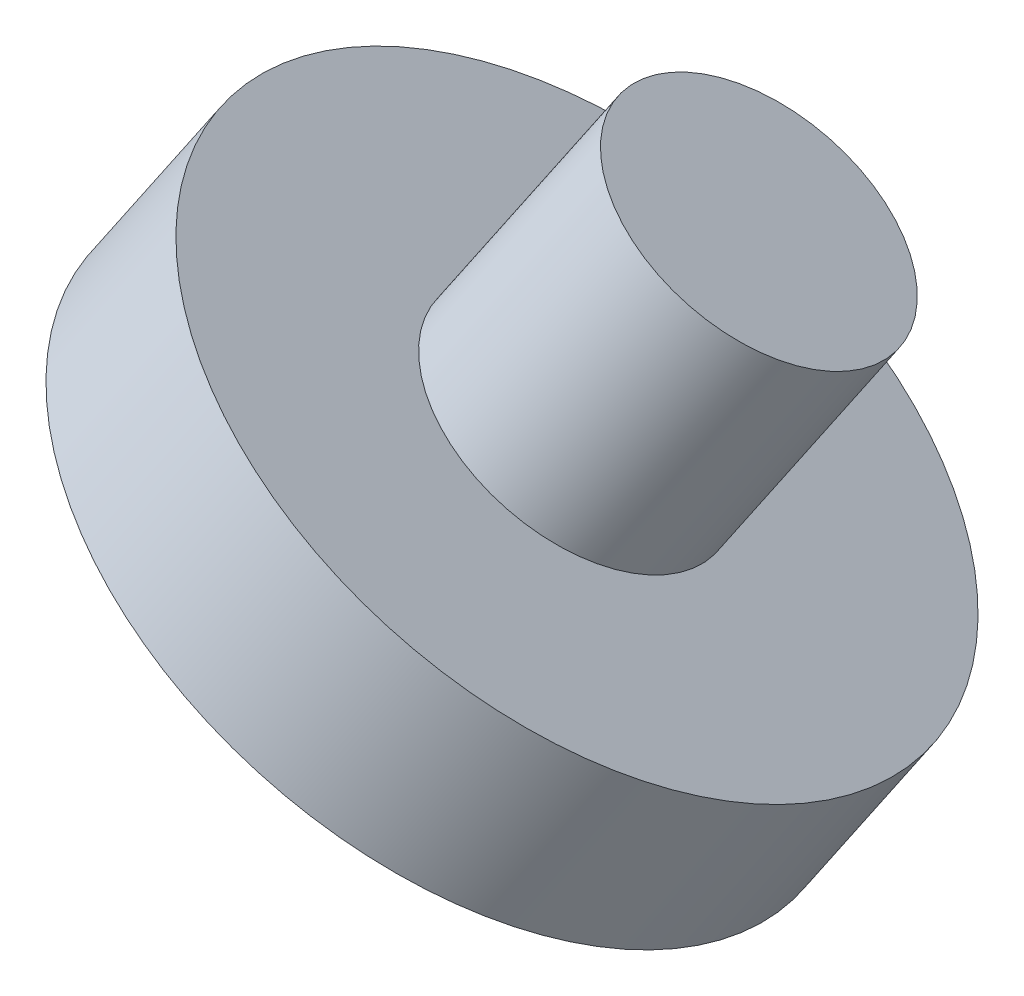
ISO-10303-21;
HEADER;
FILE_DESCRIPTION(('STEP AP214'),'2;1');
FILE_NAME('part.step','',(''),(''),'','','');
FILE_SCHEMA(('AUTOMOTIVE_DESIGN { 1 0 10303 214 1 1 1 1 }'));
ENDSEC;
DATA;
#1=APPLICATION_CONTEXT('core data for automotive mechanical design processes');
#2=APPLICATION_PROTOCOL_DEFINITION('international standard','automotive_design',2000,#1);
#3=PRODUCT_CONTEXT('',#1,'mechanical');
#4=PRODUCT('Part','Part','',(#3));
#5=PRODUCT_RELATED_PRODUCT_CATEGORY('part','',(#4));
#6=PRODUCT_DEFINITION_FORMATION('','',#4);
#7=PRODUCT_DEFINITION_CONTEXT('part definition',#1,'design');
#8=PRODUCT_DEFINITION('design','',#6,#7);
#9=PRODUCT_DEFINITION_SHAPE('','',#8);
#10=(LENGTH_UNIT() NAMED_UNIT(*) SI_UNIT(.MILLI.,.METRE.));
#11=(NAMED_UNIT(*) PLANE_ANGLE_UNIT() SI_UNIT($,.RADIAN.));
#12=(NAMED_UNIT(*) SI_UNIT($,.STERADIAN.) SOLID_ANGLE_UNIT());
#13=UNCERTAINTY_MEASURE_WITH_UNIT(LENGTH_MEASURE(1.E-05),#10,'distance_accuracy_value','');
#14=(GEOMETRIC_REPRESENTATION_CONTEXT(3) GLOBAL_UNCERTAINTY_ASSIGNED_CONTEXT((#13)) GLOBAL_UNIT_ASSIGNED_CONTEXT((#10,
#11,#12)) REPRESENTATION_CONTEXT('',''));
#15=CARTESIAN_POINT('',(0.,0.,0.));
#16=DIRECTION('',(0.,0.,1.));
#17=DIRECTION('',(1.,0.,0.));
#18=AXIS2_PLACEMENT_3D('',#15,#16,#17);
#19=CARTESIAN_POINT('',(-23.3586367544268,-69.5338322845112,532.160195440103));
#20=DIRECTION('',(-0.46981927431762,-0.830522988777868,0.299167870252041));
#21=DIRECTION('',(0.870386247740867,-0.49236955606899,0.));
#22=AXIS2_PLACEMENT_3D('',#19,#20,#21);
#23=CYLINDRICAL_SURFACE('',#22,9.99999999999999);
#24=CARTESIAN_POINT('',(-23.3586367544268,-69.5338322845112,532.160195440103));
#25=DIRECTION('',(0.46981927431762,0.830522988777868,-0.299167870252041));
#26=DIRECTION('',(-0.870386247740867,0.49236955606899,0.));
#27=AXIS2_PLACEMENT_3D('',#24,#25,#26);
#28=CIRCLE('',#27,9.99999999999999);
#29=CARTESIAN_POINT('',(-14.6547742770181,-74.4575278452011,532.160195440103));
#30=VERTEX_POINT('',#29);
#31=EDGE_CURVE('E38',#30,#30,#28,.T.);
#32=CARTESIAN_POINT('',(-25.7077331260149,-73.6864472284006,533.656034791363));
#33=DIRECTION('',(0.46981927431762,0.830522988777868,-0.299167870252041));
#34=DIRECTION('',(-0.870386247740867,0.49236955606899,0.));
#35=AXIS2_PLACEMENT_3D('',#32,#33,#34);
#36=CIRCLE('',#35,9.99999999999999);
#37=CARTESIAN_POINT('',(-17.0038706486062,-78.6101427890904,533.656034791363));
#38=VERTEX_POINT('',#37);
#39=EDGE_CURVE('E34',#38,#38,#36,.T.);
#40=CARTESIAN_POINT('',(-14.6547742770181,-74.4575278452011,532.160195440103));
#41=CARTESIAN_POINT('',(-14.6792440308888,-74.5007842508666,532.175777100012));
#42=CARTESIAN_POINT('',(-14.7037137847595,-74.5440406565321,532.191358759921));
#43=CARTESIAN_POINT('',(-14.752653292501,-74.6305534678632,532.222522079739));
#44=CARTESIAN_POINT('',(-14.7771230463717,-74.6738098735287,532.238103739648));
#45=CARTESIAN_POINT('',(-14.8260625541131,-74.7603226848597,532.269267059466));
#46=CARTESIAN_POINT('',(-14.8505323079838,-74.8035790905252,532.284848719375));
#47=CARTESIAN_POINT('',(-14.8994718157252,-74.8900919018562,532.316012039193));
#48=CARTESIAN_POINT('',(-14.9239415695959,-74.9333483075218,532.331593699102));
#49=CARTESIAN_POINT('',(-14.9728810773373,-75.0198611188528,532.36275701892));
#50=CARTESIAN_POINT('',(-14.997350831208,-75.0631175245183,532.378338678829));
#51=CARTESIAN_POINT('',(-15.0462903389495,-75.1496303358493,532.409501998647));
#52=CARTESIAN_POINT('',(-15.0707600928202,-75.1928867415148,532.425083658555));
#53=CARTESIAN_POINT('',(-15.1196996005616,-75.2793995528459,532.456246978373));
#54=CARTESIAN_POINT('',(-15.1441693544323,-75.3226559585114,532.471828638282));
#55=CARTESIAN_POINT('',(-15.1931088621737,-75.4091687698424,532.5029919581));
#56=CARTESIAN_POINT('',(-15.2175786160444,-75.4524251755079,532.518573618009));
#57=CARTESIAN_POINT('',(-15.2665181237858,-75.538937986839,532.549736937827));
#58=CARTESIAN_POINT('',(-15.2909878776566,-75.5821943925045,532.565318597736));
#59=CARTESIAN_POINT('',(-15.339927385398,-75.6687072038355,532.596481917554));
#60=CARTESIAN_POINT('',(-15.3643971392687,-75.711963609501,532.612063577463));
#61=CARTESIAN_POINT('',(-15.4133366470101,-75.798476420832,532.643226897281));
#62=CARTESIAN_POINT('',(-15.4378064008808,-75.8417328264975,532.65880855719));
#63=CARTESIAN_POINT('',(-15.4867459086222,-75.9282456378286,532.689971877008));
#64=CARTESIAN_POINT('',(-15.5112156624929,-75.9715020434941,532.705553536917));
#65=CARTESIAN_POINT('',(-15.5601551702344,-76.0580148548251,532.736716856735));
#66=CARTESIAN_POINT('',(-15.5846249241051,-76.1012712604906,532.752298516644));
#67=CARTESIAN_POINT('',(-15.6335644318465,-76.1877840718217,532.783461836462));
#68=CARTESIAN_POINT('',(-15.6580341857172,-76.2310404774872,532.79904349637));
#69=CARTESIAN_POINT('',(-15.7069736934586,-76.3175532888182,532.830206816188));
#70=CARTESIAN_POINT('',(-15.7314434473293,-76.3608096944837,532.845788476097));
#71=CARTESIAN_POINT('',(-15.7803829550707,-76.4473225058147,532.876951795915));
#72=CARTESIAN_POINT('',(-15.8048527089415,-76.4905789114803,532.892533455824));
#73=CARTESIAN_POINT('',(-15.8537922166829,-76.5770917228113,532.923696775642));
#74=CARTESIAN_POINT('',(-15.8782619705536,-76.6203481284768,532.939278435551));
#75=CARTESIAN_POINT('',(-15.927201478295,-76.7068609398078,532.970441755369));
#76=CARTESIAN_POINT('',(-15.9516712321657,-76.7501173454734,532.986023415278));
#77=CARTESIAN_POINT('',(-16.0006107399071,-76.8366301568044,533.017186735096));
#78=CARTESIAN_POINT('',(-16.0250804937778,-76.8798865624699,533.032768395005));
#79=CARTESIAN_POINT('',(-16.0740200015193,-76.9663993738009,533.063931714823));
#80=CARTESIAN_POINT('',(-16.09848975539,-77.0096557794664,533.079513374732));
#81=CARTESIAN_POINT('',(-16.1474292631314,-77.0961685907975,533.11067669455));
#82=CARTESIAN_POINT('',(-16.1718990170021,-77.139424996463,533.126258354459));
#83=CARTESIAN_POINT('',(-16.2208385247435,-77.225937807794,533.157421674277));
#84=CARTESIAN_POINT('',(-16.2453082786142,-77.2691942134595,533.173003334186));
#85=CARTESIAN_POINT('',(-16.2942477863556,-77.3557070247905,533.204166654004));
#86=CARTESIAN_POINT('',(-16.3187175402263,-77.398963430456,533.219748313913));
#87=CARTESIAN_POINT('',(-16.3676570479678,-77.4854762417871,533.25091163373));
#88=CARTESIAN_POINT('',(-16.3921268018385,-77.5287326474526,533.266493293639));
#89=CARTESIAN_POINT('',(-16.4410663095799,-77.6152454587836,533.297656613457));
#90=CARTESIAN_POINT('',(-16.4655360634506,-77.6585018644491,533.313238273366));
#91=CARTESIAN_POINT('',(-16.514475571192,-77.7450146757802,533.344401593184));
#92=CARTESIAN_POINT('',(-16.5389453250627,-77.7882710814457,533.359983253093));
#93=CARTESIAN_POINT('',(-16.5878848328042,-77.8747838927767,533.391146572911));
#94=CARTESIAN_POINT('',(-16.6123545866749,-77.9180402984422,533.40672823282));
#95=CARTESIAN_POINT('',(-16.6612940944163,-78.0045531097733,533.437891552638));
#96=CARTESIAN_POINT('',(-16.685763848287,-78.0478095154388,533.453473212547));
#97=CARTESIAN_POINT('',(-16.7347033560284,-78.1343223267698,533.484636532365));
#98=CARTESIAN_POINT('',(-16.7591731098991,-78.1775787324353,533.500218192274));
#99=CARTESIAN_POINT('',(-16.8081126176405,-78.2640915437663,533.531381512092));
#100=CARTESIAN_POINT('',(-16.8325823715113,-78.3073479494319,533.546963172001));
#101=CARTESIAN_POINT('',(-16.8815218792527,-78.3938607607629,533.578126491818));
#102=CARTESIAN_POINT('',(-16.9059916331234,-78.4371171664284,533.593708151727));
#103=CARTESIAN_POINT('',(-16.9549311408648,-78.5236299777594,533.624871471545));
#104=CARTESIAN_POINT('',(-16.9794008947355,-78.5668863834249,533.640453131454));
#105=CARTESIAN_POINT('',(-17.0038706486062,-78.6101427890904,533.656034791363));
#106=B_SPLINE_CURVE_WITH_KNOTS('',3,(#40,#41,#42,#43,#44,#45,#46,#47,#48,#49,#50,#51,#52,#53,
#54,#55,#56,#57,#58,#59,#60,#61,#62,#63,#64,#65,#66,#67,#68,#69,#70,#71,#72,#73,#74,#75,#76,#77,
#78,#79,#80,#81,#82,#83,#84,#85,#86,#87,#88,#89,#90,#91,#92,#93,#94,#95,#96,#97,#98,#99,#100,
#101,#102,#103,#104,#105),.UNSPECIFIED.,.F.,.F.,(4,2,2,2,2,2,2,2,2,2,2,2,2,2,2,2,2,2,2,2,2,2,2,
2,2,2,2,2,2,2,2,2,4),(0.,0.156249999999998,0.312500000000008,0.468750000000005,
0.624999999999982,0.781249999999981,0.93749999999999,1.09375,1.25,1.40625000000001,
1.56249999999997,1.71874999999998,1.87499999999999,2.03124999999999,2.1875,2.34375,
2.50000000000001,2.65624999999998,2.81249999999998,2.96874999999999,3.12499999999999,3.28125,
3.43750000000001,3.59375000000001,3.74999999999998,3.90624999999998,4.06249999999999,
4.21874999999999,4.375,4.53125000000001,4.68749999999998,4.84374999999998,4.99999999999998),.UNSPECIFIED.);
#107=EDGE_CURVE('BSEAM31',#30,#38,#106,.T.);
#108=ORIENTED_EDGE('',*,*,#31,.F.);
#109=ORIENTED_EDGE('',*,*,#39,.T.);
#110=ORIENTED_EDGE('',*,*,#107,.T.);
#111=ORIENTED_EDGE('',*,*,#107,.F.);
#112=EDGE_LOOP('',(#108,#110,#109,#111));
#113=FACE_BOUND('',#112,.T.);
#114=ADVANCED_FACE('F31',(#113),#23,.T.);
#115=CARTESIAN_POINT('',(-23.3586367544268,-69.5338322845112,532.160195440103));
#116=DIRECTION('',(0.46981927431762,0.830522988777868,-0.299167870252041));
#117=DIRECTION('',(-0.870386247740867,0.49236955606899,0.));
#118=AXIS2_PLACEMENT_3D('',#115,#116,#117);
#119=PLANE('',#118);
#120=CARTESIAN_POINT('',(-23.3586367544266,-69.5338322845114,532.160195440103));
#121=DIRECTION('',(0.46981927431762,0.830522988777868,-0.299167870252041));
#122=DIRECTION('',(-0.870386247740867,0.492369556068991,0.));
#123=AXIS2_PLACEMENT_3D('',#120,#121,#122);
#124=CIRCLE('',#123,3.94999999999995);
#125=CARTESIAN_POINT('',(-26.796662433003,-67.5889725380389,532.160195440103));
#126=VERTEX_POINT('',#125);
#127=EDGE_CURVE('E10',#126,#126,#124,.T.);
#128=ORIENTED_EDGE('',*,*,#127,.F.);
#129=EDGE_LOOP('',(#128));
#130=FACE_BOUND('',#129,.T.);
#131=ORIENTED_EDGE('',*,*,#31,.T.);
#132=EDGE_LOOP('',(#131));
#133=FACE_BOUND('',#132,.T.);
#134=ADVANCED_FACE('F55',(#130,#133),#119,.T.);
#135=CARTESIAN_POINT('',(-25.7077331260149,-73.6864472284006,533.656034791363));
#136=DIRECTION('',(0.46981927431762,0.830522988777868,-0.299167870252041));
#137=DIRECTION('',(-0.870386247740867,0.49236955606899,0.));
#138=AXIS2_PLACEMENT_3D('',#135,#136,#137);
#139=PLANE('',#138);
#140=ORIENTED_EDGE('',*,*,#39,.F.);
#141=EDGE_LOOP('',(#140));
#142=FACE_BOUND('',#141,.T.);
#143=ADVANCED_FACE('F52',(#142),#139,.F.);
#144=CARTESIAN_POINT('',(-20.0699018342033,-63.7201713630663,530.066020348339));
#145=DIRECTION('',(-0.46981927431762,-0.830522988777868,0.299167870252041));
#146=DIRECTION('',(0.870386247740866,-0.492369556068991,0.));
#147=AXIS2_PLACEMENT_3D('',#144,#145,#146);
#148=CYLINDRICAL_SURFACE('',#147,3.94999999999995);
#149=CARTESIAN_POINT('',(-20.0699018342033,-63.7201713630663,530.066020348339));
#150=DIRECTION('',(0.46981927431762,0.830522988777868,-0.299167870252041));
#151=DIRECTION('',(-0.870386247740867,0.492369556068991,0.));
#152=AXIS2_PLACEMENT_3D('',#149,#150,#151);
#153=CIRCLE('',#152,3.94999999999995);
#154=CARTESIAN_POINT('',(-23.5079275127796,-61.7753116165938,530.066020348339));
#155=VERTEX_POINT('',#154);
#156=EDGE_CURVE('E44',#155,#155,#153,.T.);
#157=ORIENTED_EDGE('',*,*,#156,.F.);
#158=EDGE_LOOP('',(#157));
#159=FACE_BOUND('',#158,.T.);
#160=ORIENTED_EDGE('',*,*,#127,.T.);
#161=EDGE_LOOP('',(#160));
#162=FACE_BOUND('',#161,.T.);
#163=ADVANCED_FACE('F54',(#159,#162),#148,.T.);
#164=CARTESIAN_POINT('',(-20.0699018342033,-63.7201713630663,530.066020348339));
#165=DIRECTION('',(0.46981927431762,0.830522988777868,-0.299167870252041));
#166=DIRECTION('',(-0.870386247740867,0.492369556068991,0.));
#167=AXIS2_PLACEMENT_3D('',#164,#165,#166);
#168=PLANE('',#167);
#169=ORIENTED_EDGE('',*,*,#156,.T.);
#170=EDGE_LOOP('',(#169));
#171=FACE_BOUND('',#170,.T.);
#172=ADVANCED_FACE('F60',(#171),#168,.T.);
#173=CLOSED_SHELL('',(#114,#134,#143,#163,#172));
#174=MANIFOLD_SOLID_BREP('B2',#173);
#175=ADVANCED_BREP_SHAPE_REPRESENTATION('',(#18,#174),#14);
#176=SHAPE_DEFINITION_REPRESENTATION(#9,#175);
ENDSEC;
END-ISO-10303-21;
